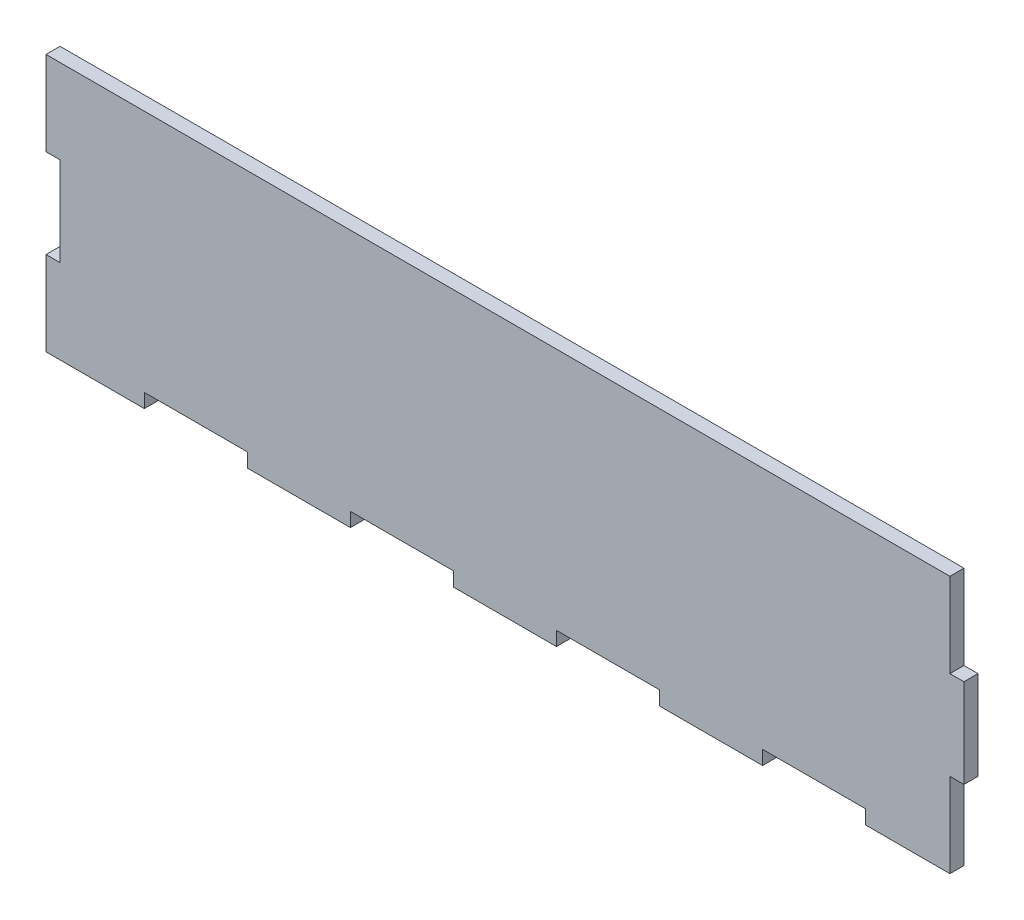
ISO-10303-21;
HEADER;
FILE_DESCRIPTION(('STEP AP214'),'2;1');
FILE_NAME('part.step','',(''),(''),'','','');
FILE_SCHEMA(('AUTOMOTIVE_DESIGN { 1 0 10303 214 1 1 1 1 }'));
ENDSEC;
DATA;
#1=APPLICATION_CONTEXT('core data for automotive mechanical design processes');
#2=APPLICATION_PROTOCOL_DEFINITION('international standard','automotive_design',2000,#1);
#3=PRODUCT_CONTEXT('',#1,'mechanical');
#4=PRODUCT('Part','Part','',(#3));
#5=PRODUCT_RELATED_PRODUCT_CATEGORY('part','',(#4));
#6=PRODUCT_DEFINITION_FORMATION('','',#4);
#7=PRODUCT_DEFINITION_CONTEXT('part definition',#1,'design');
#8=PRODUCT_DEFINITION('design','',#6,#7);
#9=PRODUCT_DEFINITION_SHAPE('','',#8);
#10=(LENGTH_UNIT() NAMED_UNIT(*) SI_UNIT(.MILLI.,.METRE.));
#11=(NAMED_UNIT(*) PLANE_ANGLE_UNIT() SI_UNIT($,.RADIAN.));
#12=(NAMED_UNIT(*) SI_UNIT($,.STERADIAN.) SOLID_ANGLE_UNIT());
#13=UNCERTAINTY_MEASURE_WITH_UNIT(LENGTH_MEASURE(1.E-05),#10,'distance_accuracy_value','');
#14=(GEOMETRIC_REPRESENTATION_CONTEXT(3) GLOBAL_UNCERTAINTY_ASSIGNED_CONTEXT((#13)) GLOBAL_UNIT_ASSIGNED_CONTEXT((#10,
#11,#12)) REPRESENTATION_CONTEXT('',''));
#15=CARTESIAN_POINT('',(0.,0.,0.));
#16=DIRECTION('',(0.,0.,1.));
#17=DIRECTION('',(1.,0.,0.));
#18=AXIS2_PLACEMENT_3D('',#15,#16,#17);
#19=CARTESIAN_POINT('',(0.,-24.5,3.));
#20=DIRECTION('',(0.,1.,0.));
#21=DIRECTION('',(0.,0.,1.));
#22=AXIS2_PLACEMENT_3D('',#19,#20,#21);
#23=PLANE('',#22);
#24=DIRECTION('',(1.,0.,0.));
#25=VECTOR('',#24,1.);
#26=CARTESIAN_POINT('',(0.,-24.5,0.));
#27=LINE('',#26,#25);
#28=CARTESIAN_POINT('',(55.,-24.5,0.));
#29=VERTEX_POINT('',#28);
#30=CARTESIAN_POINT('',(77.,-24.5,0.));
#31=VERTEX_POINT('',#30);
#32=EDGE_CURVE('E290',#29,#31,#27,.T.);
#33=ORIENTED_EDGE('',*,*,#32,.T.);
#34=DIRECTION('',(0.,0.,-1.));
#35=VECTOR('',#34,1.);
#36=CARTESIAN_POINT('',(77.,-24.5,3.));
#37=LINE('',#36,#35);
#38=CARTESIAN_POINT('',(77.,-24.5,3.));
#39=VERTEX_POINT('',#38);
#40=EDGE_CURVE('E11',#39,#31,#37,.T.);
#41=ORIENTED_EDGE('',*,*,#40,.F.);
#42=DIRECTION('',(1.,0.,0.));
#43=VECTOR('',#42,1.);
#44=CARTESIAN_POINT('',(0.,-24.5,3.));
#45=LINE('',#44,#43);
#46=CARTESIAN_POINT('',(55.,-24.5,3.));
#47=VERTEX_POINT('',#46);
#48=EDGE_CURVE('E263',#47,#39,#45,.T.);
#49=ORIENTED_EDGE('',*,*,#48,.F.);
#50=DIRECTION('',(0.,0.,-1.));
#51=VECTOR('',#50,1.);
#52=CARTESIAN_POINT('',(55.,-24.5,3.));
#53=LINE('',#52,#51);
#54=EDGE_CURVE('E249',#47,#29,#53,.T.);
#55=ORIENTED_EDGE('',*,*,#54,.T.);
#56=EDGE_LOOP('',(#33,#41,#49,#55));
#57=FACE_BOUND('',#56,.T.);
#58=ADVANCED_FACE('F35',(#57),#23,.F.);
#59=CARTESIAN_POINT('',(77.0000000000001,-3.56196553733905E-13,3.));
#60=DIRECTION('',(1.,0.,0.));
#61=DIRECTION('',(0.,1.,0.));
#62=AXIS2_PLACEMENT_3D('',#59,#60,#61);
#63=PLANE('',#62);
#64=DIRECTION('',(0.,-1.,0.));
#65=VECTOR('',#64,1.);
#66=CARTESIAN_POINT('',(77.0000000000001,-3.56196553733905E-13,0.));
#67=LINE('',#66,#65);
#68=CARTESIAN_POINT('',(77.,-27.5,0.));
#69=VERTEX_POINT('',#68);
#70=EDGE_CURVE('E293',#31,#69,#67,.T.);
#71=ORIENTED_EDGE('',*,*,#70,.T.);
#72=DIRECTION('',(0.,0.,-1.));
#73=VECTOR('',#72,1.);
#74=CARTESIAN_POINT('',(77.,-27.5,3.));
#75=LINE('',#74,#73);
#76=CARTESIAN_POINT('',(77.,-27.5,3.));
#77=VERTEX_POINT('',#76);
#78=EDGE_CURVE('E43',#77,#69,#75,.T.);
#79=ORIENTED_EDGE('',*,*,#78,.F.);
#80=DIRECTION('',(0.,-1.,0.));
#81=VECTOR('',#80,1.);
#82=CARTESIAN_POINT('',(77.0000000000001,-3.56196553733905E-13,3.));
#83=LINE('',#82,#81);
#84=EDGE_CURVE('E154',#39,#77,#83,.T.);
#85=ORIENTED_EDGE('',*,*,#84,.F.);
#86=ORIENTED_EDGE('',*,*,#40,.T.);
#87=EDGE_LOOP('',(#71,#79,#85,#86));
#88=FACE_BOUND('',#87,.T.);
#89=ADVANCED_FACE('F535',(#88),#63,.F.);
#90=CARTESIAN_POINT('',(0.,-27.5,3.));
#91=DIRECTION('',(0.,1.,0.));
#92=DIRECTION('',(0.,0.,1.));
#93=AXIS2_PLACEMENT_3D('',#90,#91,#92);
#94=PLANE('',#93);
#95=DIRECTION('',(1.,0.,0.));
#96=VECTOR('',#95,1.);
#97=CARTESIAN_POINT('',(0.,-27.5,0.));
#98=LINE('',#97,#96);
#99=CARTESIAN_POINT('',(95.,-27.5,0.));
#100=VERTEX_POINT('',#99);
#101=EDGE_CURVE('E295',#69,#100,#98,.T.);
#102=ORIENTED_EDGE('',*,*,#101,.T.);
#103=DIRECTION('',(0.,0.,-1.));
#104=VECTOR('',#103,1.);
#105=CARTESIAN_POINT('',(95.,-27.5,3.));
#106=LINE('',#105,#104);
#107=CARTESIAN_POINT('',(95.,-27.5,3.));
#108=VERTEX_POINT('',#107);
#109=EDGE_CURVE('E405',#108,#100,#106,.T.);
#110=ORIENTED_EDGE('',*,*,#109,.F.);
#111=DIRECTION('',(1.,0.,0.));
#112=VECTOR('',#111,1.);
#113=CARTESIAN_POINT('',(0.,-27.5,3.));
#114=LINE('',#113,#112);
#115=EDGE_CURVE('E248',#77,#108,#114,.T.);
#116=ORIENTED_EDGE('',*,*,#115,.F.);
#117=ORIENTED_EDGE('',*,*,#78,.T.);
#118=EDGE_LOOP('',(#102,#110,#116,#117));
#119=FACE_BOUND('',#118,.T.);
#120=ADVANCED_FACE('F409',(#119),#94,.F.);
#121=CARTESIAN_POINT('',(95.,0.,3.));
#122=DIRECTION('',(1.,0.,0.));
#123=DIRECTION('',(0.,0.,-1.));
#124=AXIS2_PLACEMENT_3D('',#121,#122,#123);
#125=PLANE('',#124);
#126=DIRECTION('',(0.,-1.,0.));
#127=VECTOR('',#126,1.);
#128=CARTESIAN_POINT('',(95.,0.,0.));
#129=LINE('',#128,#127);
#130=CARTESIAN_POINT('',(95.,-9.5,0.));
#131=VERTEX_POINT('',#130);
#132=EDGE_CURVE('E298',#131,#100,#129,.T.);
#133=ORIENTED_EDGE('',*,*,#132,.F.);
#134=DIRECTION('',(0.,0.,-1.));
#135=VECTOR('',#134,1.);
#136=CARTESIAN_POINT('',(95.,-9.5,3.));
#137=LINE('',#136,#135);
#138=CARTESIAN_POINT('',(95.,-9.5,3.));
#139=VERTEX_POINT('',#138);
#140=EDGE_CURVE('E403',#139,#131,#137,.T.);
#141=ORIENTED_EDGE('',*,*,#140,.F.);
#142=DIRECTION('',(0.,-1.,0.));
#143=VECTOR('',#142,1.);
#144=CARTESIAN_POINT('',(95.,0.,3.));
#145=LINE('',#144,#143);
#146=EDGE_CURVE('E256',#139,#108,#145,.T.);
#147=ORIENTED_EDGE('',*,*,#146,.T.);
#148=ORIENTED_EDGE('',*,*,#109,.T.);
#149=EDGE_LOOP('',(#133,#141,#147,#148));
#150=FACE_BOUND('',#149,.T.);
#151=ADVANCED_FACE('F417',(#150),#125,.T.);
#152=CARTESIAN_POINT('',(0.,-9.50000000000006,3.));
#153=DIRECTION('',(0.,-1.,0.));
#154=DIRECTION('',(1.,0.,0.));
#155=AXIS2_PLACEMENT_3D('',#152,#153,#154);
#156=PLANE('',#155);
#157=DIRECTION('',(-1.,0.,0.));
#158=VECTOR('',#157,1.);
#159=CARTESIAN_POINT('',(0.,-9.50000000000006,0.));
#160=LINE('',#159,#158);
#161=CARTESIAN_POINT('',(98.,-9.5,0.));
#162=VERTEX_POINT('',#161);
#163=EDGE_CURVE('E302',#162,#131,#160,.T.);
#164=ORIENTED_EDGE('',*,*,#163,.F.);
#165=DIRECTION('',(0.,0.,-1.));
#166=VECTOR('',#165,1.);
#167=CARTESIAN_POINT('',(98.,-9.5,3.));
#168=LINE('',#167,#166);
#169=CARTESIAN_POINT('',(98.,-9.5,3.));
#170=VERTEX_POINT('',#169);
#171=EDGE_CURVE('E401',#170,#162,#168,.T.);
#172=ORIENTED_EDGE('',*,*,#171,.F.);
#173=DIRECTION('',(-1.,0.,0.));
#174=VECTOR('',#173,1.);
#175=CARTESIAN_POINT('',(0.,-9.50000000000006,3.));
#176=LINE('',#175,#174);
#177=EDGE_CURVE('E262',#170,#139,#176,.T.);
#178=ORIENTED_EDGE('',*,*,#177,.T.);
#179=ORIENTED_EDGE('',*,*,#140,.T.);
#180=EDGE_LOOP('',(#164,#172,#178,#179));
#181=FACE_BOUND('',#180,.T.);
#182=ADVANCED_FACE('F421',(#181),#156,.T.);
#183=CARTESIAN_POINT('',(98.,0.,3.));
#184=DIRECTION('',(-1.,0.,0.));
#185=DIRECTION('',(0.,0.,1.));
#186=AXIS2_PLACEMENT_3D('',#183,#184,#185);
#187=PLANE('',#186);
#188=DIRECTION('',(0.,1.,0.));
#189=VECTOR('',#188,1.);
#190=CARTESIAN_POINT('',(98.,0.,0.));
#191=LINE('',#190,#189);
#192=CARTESIAN_POINT('',(98.,9.50000000000002,0.));
#193=VERTEX_POINT('',#192);
#194=EDGE_CURVE('E305',#162,#193,#191,.T.);
#195=ORIENTED_EDGE('',*,*,#194,.T.);
#196=DIRECTION('',(0.,0.,-1.));
#197=VECTOR('',#196,1.);
#198=CARTESIAN_POINT('',(98.,9.50000000000002,3.));
#199=LINE('',#198,#197);
#200=CARTESIAN_POINT('',(98.,9.50000000000002,3.));
#201=VERTEX_POINT('',#200);
#202=EDGE_CURVE('E398',#201,#193,#199,.T.);
#203=ORIENTED_EDGE('',*,*,#202,.F.);
#204=DIRECTION('',(0.,1.,0.));
#205=VECTOR('',#204,1.);
#206=CARTESIAN_POINT('',(98.,0.,3.));
#207=LINE('',#206,#205);
#208=EDGE_CURVE('E423',#170,#201,#207,.T.);
#209=ORIENTED_EDGE('',*,*,#208,.F.);
#210=ORIENTED_EDGE('',*,*,#171,.T.);
#211=EDGE_LOOP('',(#195,#203,#209,#210));
#212=FACE_BOUND('',#211,.T.);
#213=ADVANCED_FACE('F525',(#212),#187,.F.);
#214=CARTESIAN_POINT('',(0.,9.50000000000074,3.));
#215=DIRECTION('',(0.,-1.,0.));
#216=DIRECTION('',(1.,0.,0.));
#217=AXIS2_PLACEMENT_3D('',#214,#215,#216);
#218=PLANE('',#217);
#219=DIRECTION('',(-1.,0.,0.));
#220=VECTOR('',#219,1.);
#221=CARTESIAN_POINT('',(0.,9.50000000000074,0.));
#222=LINE('',#221,#220);
#223=CARTESIAN_POINT('',(95.,9.50000000000003,0.));
#224=VERTEX_POINT('',#223);
#225=EDGE_CURVE('E307',#193,#224,#222,.T.);
#226=ORIENTED_EDGE('',*,*,#225,.T.);
#227=DIRECTION('',(0.,0.,-1.));
#228=VECTOR('',#227,1.);
#229=CARTESIAN_POINT('',(95.,9.50000000000003,3.));
#230=LINE('',#229,#228);
#231=CARTESIAN_POINT('',(95.,9.50000000000003,3.));
#232=VERTEX_POINT('',#231);
#233=EDGE_CURVE('E395',#232,#224,#230,.T.);
#234=ORIENTED_EDGE('',*,*,#233,.F.);
#235=DIRECTION('',(-1.,0.,0.));
#236=VECTOR('',#235,1.);
#237=CARTESIAN_POINT('',(0.,9.50000000000074,3.));
#238=LINE('',#237,#236);
#239=EDGE_CURVE('E425',#201,#232,#238,.T.);
#240=ORIENTED_EDGE('',*,*,#239,.F.);
#241=ORIENTED_EDGE('',*,*,#202,.T.);
#242=EDGE_LOOP('',(#226,#234,#240,#241));
#243=FACE_BOUND('',#242,.T.);
#244=ADVANCED_FACE('F522',(#243),#218,.F.);
#245=CARTESIAN_POINT('',(95.,0.,3.));
#246=DIRECTION('',(-1.,0.,0.));
#247=DIRECTION('',(0.,0.,1.));
#248=AXIS2_PLACEMENT_3D('',#245,#246,#247);
#249=PLANE('',#248);
#250=DIRECTION('',(0.,1.,0.));
#251=VECTOR('',#250,1.);
#252=CARTESIAN_POINT('',(95.,0.,0.));
#253=LINE('',#252,#251);
#254=CARTESIAN_POINT('',(95.,27.5,0.));
#255=VERTEX_POINT('',#254);
#256=EDGE_CURVE('E309',#224,#255,#253,.T.);
#257=ORIENTED_EDGE('',*,*,#256,.T.);
#258=DIRECTION('',(0.,0.,-1.));
#259=VECTOR('',#258,1.);
#260=CARTESIAN_POINT('',(95.,27.5,3.));
#261=LINE('',#260,#259);
#262=CARTESIAN_POINT('',(95.,27.5,3.));
#263=VERTEX_POINT('',#262);
#264=EDGE_CURVE('E393',#263,#255,#261,.T.);
#265=ORIENTED_EDGE('',*,*,#264,.F.);
#266=DIRECTION('',(0.,1.,0.));
#267=VECTOR('',#266,1.);
#268=CARTESIAN_POINT('',(95.,0.,3.));
#269=LINE('',#268,#267);
#270=EDGE_CURVE('E429',#232,#263,#269,.T.);
#271=ORIENTED_EDGE('',*,*,#270,.F.);
#272=ORIENTED_EDGE('',*,*,#233,.T.);
#273=EDGE_LOOP('',(#257,#265,#271,#272));
#274=FACE_BOUND('',#273,.T.);
#275=ADVANCED_FACE('F518',(#274),#249,.F.);
#276=CARTESIAN_POINT('',(0.,27.5,3.));
#277=DIRECTION('',(0.,1.,0.));
#278=DIRECTION('',(0.,0.,1.));
#279=AXIS2_PLACEMENT_3D('',#276,#277,#278);
#280=PLANE('',#279);
#281=DIRECTION('',(1.,0.,0.));
#282=VECTOR('',#281,1.);
#283=CARTESIAN_POINT('',(0.,27.5,0.));
#284=LINE('',#283,#282);
#285=CARTESIAN_POINT('',(-98.,27.5,0.));
#286=VERTEX_POINT('',#285);
#287=EDGE_CURVE('E312',#286,#255,#284,.T.);
#288=ORIENTED_EDGE('',*,*,#287,.F.);
#289=DIRECTION('',(0.,0.,-1.));
#290=VECTOR('',#289,1.);
#291=CARTESIAN_POINT('',(-98.,27.5,3.));
#292=LINE('',#291,#290);
#293=CARTESIAN_POINT('',(-98.,27.5,3.));
#294=VERTEX_POINT('',#293);
#295=EDGE_CURVE('E391',#294,#286,#292,.T.);
#296=ORIENTED_EDGE('',*,*,#295,.F.);
#297=DIRECTION('',(1.,0.,0.));
#298=VECTOR('',#297,1.);
#299=CARTESIAN_POINT('',(0.,27.5,3.));
#300=LINE('',#299,#298);
#301=EDGE_CURVE('E431',#294,#263,#300,.T.);
#302=ORIENTED_EDGE('',*,*,#301,.T.);
#303=ORIENTED_EDGE('',*,*,#264,.T.);
#304=EDGE_LOOP('',(#288,#296,#302,#303));
#305=FACE_BOUND('',#304,.T.);
#306=ADVANCED_FACE('F513',(#305),#280,.T.);
#307=CARTESIAN_POINT('',(-98.,0.,3.));
#308=DIRECTION('',(-1.,0.,0.));
#309=DIRECTION('',(0.,0.,1.));
#310=AXIS2_PLACEMENT_3D('',#307,#308,#309);
#311=PLANE('',#310);
#312=DIRECTION('',(0.,1.,0.));
#313=VECTOR('',#312,1.);
#314=CARTESIAN_POINT('',(-98.,0.,0.));
#315=LINE('',#314,#313);
#316=CARTESIAN_POINT('',(-98.,9.5,0.));
#317=VERTEX_POINT('',#316);
#318=EDGE_CURVE('E315',#317,#286,#315,.T.);
#319=ORIENTED_EDGE('',*,*,#318,.F.);
#320=DIRECTION('',(0.,0.,-1.));
#321=VECTOR('',#320,1.);
#322=CARTESIAN_POINT('',(-98.,9.5,3.));
#323=LINE('',#322,#321);
#324=CARTESIAN_POINT('',(-98.,9.5,3.));
#325=VERTEX_POINT('',#324);
#326=EDGE_CURVE('E389',#325,#317,#323,.T.);
#327=ORIENTED_EDGE('',*,*,#326,.F.);
#328=DIRECTION('',(0.,1.,0.));
#329=VECTOR('',#328,1.);
#330=CARTESIAN_POINT('',(-98.,0.,3.));
#331=LINE('',#330,#329);
#332=EDGE_CURVE('E274',#325,#294,#331,.T.);
#333=ORIENTED_EDGE('',*,*,#332,.T.);
#334=ORIENTED_EDGE('',*,*,#295,.T.);
#335=EDGE_LOOP('',(#319,#327,#333,#334));
#336=FACE_BOUND('',#335,.T.);
#337=ADVANCED_FACE('F508',(#336),#311,.T.);
#338=CARTESIAN_POINT('',(0.,9.49999999999989,3.));
#339=DIRECTION('',(0.,-1.,0.));
#340=DIRECTION('',(1.,0.,0.));
#341=AXIS2_PLACEMENT_3D('',#338,#339,#340);
#342=PLANE('',#341);
#343=DIRECTION('',(-1.,0.,0.));
#344=VECTOR('',#343,1.);
#345=CARTESIAN_POINT('',(0.,9.49999999999989,0.));
#346=LINE('',#345,#344);
#347=CARTESIAN_POINT('',(-95.,9.5,0.));
#348=VERTEX_POINT('',#347);
#349=EDGE_CURVE('E318',#348,#317,#346,.T.);
#350=ORIENTED_EDGE('',*,*,#349,.F.);
#351=DIRECTION('',(0.,0.,-1.));
#352=VECTOR('',#351,1.);
#353=CARTESIAN_POINT('',(-95.,9.5,3.));
#354=LINE('',#353,#352);
#355=CARTESIAN_POINT('',(-95.,9.5,3.));
#356=VERTEX_POINT('',#355);
#357=EDGE_CURVE('E387',#356,#348,#354,.T.);
#358=ORIENTED_EDGE('',*,*,#357,.F.);
#359=DIRECTION('',(-1.,0.,0.));
#360=VECTOR('',#359,1.);
#361=CARTESIAN_POINT('',(0.,9.49999999999989,3.));
#362=LINE('',#361,#360);
#363=EDGE_CURVE('E435',#356,#325,#362,.T.);
#364=ORIENTED_EDGE('',*,*,#363,.T.);
#365=ORIENTED_EDGE('',*,*,#326,.T.);
#366=EDGE_LOOP('',(#350,#358,#364,#365));
#367=FACE_BOUND('',#366,.T.);
#368=ADVANCED_FACE('F504',(#367),#342,.T.);
#369=CARTESIAN_POINT('',(-95.,0.,3.));
#370=DIRECTION('',(-1.,0.,0.));
#371=DIRECTION('',(0.,0.,1.));
#372=AXIS2_PLACEMENT_3D('',#369,#370,#371);
#373=PLANE('',#372);
#374=DIRECTION('',(0.,1.,0.));
#375=VECTOR('',#374,1.);
#376=CARTESIAN_POINT('',(-95.,0.,0.));
#377=LINE('',#376,#375);
#378=CARTESIAN_POINT('',(-95.,-9.50000000000002,0.));
#379=VERTEX_POINT('',#378);
#380=EDGE_CURVE('E322',#379,#348,#377,.T.);
#381=ORIENTED_EDGE('',*,*,#380,.F.);
#382=DIRECTION('',(0.,0.,-1.));
#383=VECTOR('',#382,1.);
#384=CARTESIAN_POINT('',(-95.,-9.50000000000002,3.));
#385=LINE('',#384,#383);
#386=CARTESIAN_POINT('',(-95.,-9.50000000000002,3.));
#387=VERTEX_POINT('',#386);
#388=EDGE_CURVE('E385',#387,#379,#385,.T.);
#389=ORIENTED_EDGE('',*,*,#388,.F.);
#390=DIRECTION('',(0.,1.,0.));
#391=VECTOR('',#390,1.);
#392=CARTESIAN_POINT('',(-95.,0.,3.));
#393=LINE('',#392,#391);
#394=EDGE_CURVE('E438',#387,#356,#393,.T.);
#395=ORIENTED_EDGE('',*,*,#394,.T.);
#396=ORIENTED_EDGE('',*,*,#357,.T.);
#397=EDGE_LOOP('',(#381,#389,#395,#396));
#398=FACE_BOUND('',#397,.T.);
#399=ADVANCED_FACE('F502',(#398),#373,.T.);
#400=CARTESIAN_POINT('',(0.,-9.50000000000079,3.));
#401=DIRECTION('',(0.,1.,0.));
#402=DIRECTION('',(-1.,0.,0.));
#403=AXIS2_PLACEMENT_3D('',#400,#401,#402);
#404=PLANE('',#403);
#405=DIRECTION('',(1.,0.,0.));
#406=VECTOR('',#405,1.);
#407=CARTESIAN_POINT('',(0.,-9.50000000000079,0.));
#408=LINE('',#407,#406);
#409=CARTESIAN_POINT('',(-98.,-9.5,0.));
#410=VERTEX_POINT('',#409);
#411=EDGE_CURVE('E325',#410,#379,#408,.T.);
#412=ORIENTED_EDGE('',*,*,#411,.F.);
#413=DIRECTION('',(0.,0.,-1.));
#414=VECTOR('',#413,1.);
#415=CARTESIAN_POINT('',(-98.,-9.5,3.));
#416=LINE('',#415,#414);
#417=CARTESIAN_POINT('',(-98.,-9.5,3.));
#418=VERTEX_POINT('',#417);
#419=EDGE_CURVE('E383',#418,#410,#416,.T.);
#420=ORIENTED_EDGE('',*,*,#419,.F.);
#421=DIRECTION('',(1.,0.,0.));
#422=VECTOR('',#421,1.);
#423=CARTESIAN_POINT('',(0.,-9.50000000000079,3.));
#424=LINE('',#423,#422);
#425=EDGE_CURVE('E272',#418,#387,#424,.T.);
#426=ORIENTED_EDGE('',*,*,#425,.T.);
#427=ORIENTED_EDGE('',*,*,#388,.T.);
#428=EDGE_LOOP('',(#412,#420,#426,#427));
#429=FACE_BOUND('',#428,.T.);
#430=ADVANCED_FACE('F445',(#429),#404,.T.);
#431=CARTESIAN_POINT('',(-98.,-27.5,0.));
#432=VERTEX_POINT('',#431);
#433=EDGE_CURVE('E319',#432,#410,#315,.T.);
#434=ORIENTED_EDGE('',*,*,#433,.F.);
#435=DIRECTION('',(0.,0.,-1.));
#436=VECTOR('',#435,1.);
#437=CARTESIAN_POINT('',(-98.,-27.5,3.));
#438=LINE('',#437,#436);
#439=CARTESIAN_POINT('',(-98.,-27.5,3.));
#440=VERTEX_POINT('',#439);
#441=EDGE_CURVE('E381',#440,#432,#438,.T.);
#442=ORIENTED_EDGE('',*,*,#441,.F.);
#443=EDGE_CURVE('E265',#440,#418,#331,.T.);
#444=ORIENTED_EDGE('',*,*,#443,.T.);
#445=ORIENTED_EDGE('',*,*,#419,.T.);
#446=EDGE_LOOP('',(#434,#442,#444,#445));
#447=FACE_BOUND('',#446,.T.);
#448=ADVANCED_FACE('F451',(#447),#311,.T.);
#449=CARTESIAN_POINT('',(-77.,-27.5,0.));
#450=VERTEX_POINT('',#449);
#451=EDGE_CURVE('E299',#432,#450,#98,.T.);
#452=ORIENTED_EDGE('',*,*,#451,.T.);
#453=DIRECTION('',(0.,0.,-1.));
#454=VECTOR('',#453,1.);
#455=CARTESIAN_POINT('',(-77.,-27.5,3.));
#456=LINE('',#455,#454);
#457=CARTESIAN_POINT('',(-77.,-27.5,3.));
#458=VERTEX_POINT('',#457);
#459=EDGE_CURVE('E378',#458,#450,#456,.T.);
#460=ORIENTED_EDGE('',*,*,#459,.F.);
#461=EDGE_CURVE('E257',#440,#458,#114,.T.);
#462=ORIENTED_EDGE('',*,*,#461,.F.);
#463=ORIENTED_EDGE('',*,*,#441,.T.);
#464=EDGE_LOOP('',(#452,#460,#462,#463));
#465=FACE_BOUND('',#464,.T.);
#466=ADVANCED_FACE('F455',(#465),#94,.F.);
#467=CARTESIAN_POINT('',(-77.,0.,3.));
#468=DIRECTION('',(-1.,0.,0.));
#469=DIRECTION('',(0.,0.,1.));
#470=AXIS2_PLACEMENT_3D('',#467,#468,#469);
#471=PLANE('',#470);
#472=DIRECTION('',(0.,1.,0.));
#473=VECTOR('',#472,1.);
#474=CARTESIAN_POINT('',(-77.,0.,0.));
#475=LINE('',#474,#473);
#476=CARTESIAN_POINT('',(-77.,-24.5,0.));
#477=VERTEX_POINT('',#476);
#478=EDGE_CURVE('E328',#450,#477,#475,.T.);
#479=ORIENTED_EDGE('',*,*,#478,.T.);
#480=DIRECTION('',(0.,0.,-1.));
#481=VECTOR('',#480,1.);
#482=CARTESIAN_POINT('',(-77.,-24.5,3.));
#483=LINE('',#482,#481);
#484=CARTESIAN_POINT('',(-77.,-24.5,3.));
#485=VERTEX_POINT('',#484);
#486=EDGE_CURVE('E375',#485,#477,#483,.T.);
#487=ORIENTED_EDGE('',*,*,#486,.F.);
#488=DIRECTION('',(0.,1.,0.));
#489=VECTOR('',#488,1.);
#490=CARTESIAN_POINT('',(-77.,0.,3.));
#491=LINE('',#490,#489);
#492=EDGE_CURVE('E264',#458,#485,#491,.T.);
#493=ORIENTED_EDGE('',*,*,#492,.F.);
#494=ORIENTED_EDGE('',*,*,#459,.T.);
#495=EDGE_LOOP('',(#479,#487,#493,#494));
#496=FACE_BOUND('',#495,.T.);
#497=ADVANCED_FACE('F460',(#496),#471,.F.);
#498=CARTESIAN_POINT('',(0.,-24.5,3.));
#499=DIRECTION('',(0.,1.,0.));
#500=DIRECTION('',(0.,0.,1.));
#501=AXIS2_PLACEMENT_3D('',#498,#499,#500);
#502=PLANE('',#501);
#503=DIRECTION('',(1.,0.,0.));
#504=VECTOR('',#503,1.);
#505=CARTESIAN_POINT('',(0.,-24.5,0.));
#506=LINE('',#505,#504);
#507=CARTESIAN_POINT('',(-55.,-24.5,0.));
#508=VERTEX_POINT('',#507);
#509=EDGE_CURVE('E330',#477,#508,#506,.T.);
#510=ORIENTED_EDGE('',*,*,#509,.T.);
#511=DIRECTION('',(0.,0.,-1.));
#512=VECTOR('',#511,1.);
#513=CARTESIAN_POINT('',(-55.,-24.5,3.));
#514=LINE('',#513,#512);
#515=CARTESIAN_POINT('',(-55.,-24.5,3.));
#516=VERTEX_POINT('',#515);
#517=EDGE_CURVE('E372',#516,#508,#514,.T.);
#518=ORIENTED_EDGE('',*,*,#517,.F.);
#519=DIRECTION('',(1.,0.,0.));
#520=VECTOR('',#519,1.);
#521=CARTESIAN_POINT('',(0.,-24.5,3.));
#522=LINE('',#521,#520);
#523=EDGE_CURVE('E269',#485,#516,#522,.T.);
#524=ORIENTED_EDGE('',*,*,#523,.F.);
#525=ORIENTED_EDGE('',*,*,#486,.T.);
#526=EDGE_LOOP('',(#510,#518,#524,#525));
#527=FACE_BOUND('',#526,.T.);
#528=ADVANCED_FACE('F464',(#527),#502,.F.);
#529=CARTESIAN_POINT('',(-54.9999999999999,1.27213054904966E-13,3.));
#530=DIRECTION('',(1.,0.,0.));
#531=DIRECTION('',(0.,1.,0.));
#532=AXIS2_PLACEMENT_3D('',#529,#530,#531);
#533=PLANE('',#532);
#534=DIRECTION('',(0.,-1.,0.));
#535=VECTOR('',#534,1.);
#536=CARTESIAN_POINT('',(-54.9999999999999,1.27213054904966E-13,0.));
#537=LINE('',#536,#535);
#538=CARTESIAN_POINT('',(-55.,-27.5,0.));
#539=VERTEX_POINT('',#538);
#540=EDGE_CURVE('E332',#508,#539,#537,.T.);
#541=ORIENTED_EDGE('',*,*,#540,.T.);
#542=DIRECTION('',(0.,0.,-1.));
#543=VECTOR('',#542,1.);
#544=CARTESIAN_POINT('',(-55.,-27.5,3.));
#545=LINE('',#544,#543);
#546=CARTESIAN_POINT('',(-55.,-27.5,3.));
#547=VERTEX_POINT('',#546);
#548=EDGE_CURVE('E369',#547,#539,#545,.T.);
#549=ORIENTED_EDGE('',*,*,#548,.F.);
#550=DIRECTION('',(0.,-1.,0.));
#551=VECTOR('',#550,1.);
#552=CARTESIAN_POINT('',(-54.9999999999999,1.27213054904966E-13,3.));
#553=LINE('',#552,#551);
#554=EDGE_CURVE('E276',#516,#547,#553,.T.);
#555=ORIENTED_EDGE('',*,*,#554,.F.);
#556=ORIENTED_EDGE('',*,*,#517,.T.);
#557=EDGE_LOOP('',(#541,#549,#555,#556));
#558=FACE_BOUND('',#557,.T.);
#559=ADVANCED_FACE('F468',(#558),#533,.F.);
#560=CARTESIAN_POINT('',(-33.,-27.5,0.));
#561=VERTEX_POINT('',#560);
#562=EDGE_CURVE('E334',#539,#561,#98,.T.);
#563=ORIENTED_EDGE('',*,*,#562,.T.);
#564=DIRECTION('',(0.,0.,-1.));
#565=VECTOR('',#564,1.);
#566=CARTESIAN_POINT('',(-33.,-27.5,3.));
#567=LINE('',#566,#565);
#568=CARTESIAN_POINT('',(-33.,-27.5,3.));
#569=VERTEX_POINT('',#568);
#570=EDGE_CURVE('E366',#569,#561,#567,.T.);
#571=ORIENTED_EDGE('',*,*,#570,.F.);
#572=EDGE_CURVE('E255',#547,#569,#114,.T.);
#573=ORIENTED_EDGE('',*,*,#572,.F.);
#574=ORIENTED_EDGE('',*,*,#548,.T.);
#575=EDGE_LOOP('',(#563,#571,#573,#574));
#576=FACE_BOUND('',#575,.T.);
#577=ADVANCED_FACE('F471',(#576),#94,.F.);
#578=CARTESIAN_POINT('',(-33.,0.,3.));
#579=DIRECTION('',(-1.,0.,0.));
#580=DIRECTION('',(0.,0.,1.));
#581=AXIS2_PLACEMENT_3D('',#578,#579,#580);
#582=PLANE('',#581);
#583=DIRECTION('',(0.,1.,0.));
#584=VECTOR('',#583,1.);
#585=CARTESIAN_POINT('',(-33.,0.,0.));
#586=LINE('',#585,#584);
#587=CARTESIAN_POINT('',(-33.,-24.5,0.));
#588=VERTEX_POINT('',#587);
#589=EDGE_CURVE('E335',#561,#588,#586,.T.);
#590=ORIENTED_EDGE('',*,*,#589,.T.);
#591=DIRECTION('',(0.,0.,-1.));
#592=VECTOR('',#591,1.);
#593=CARTESIAN_POINT('',(-33.,-24.5,3.));
#594=LINE('',#593,#592);
#595=CARTESIAN_POINT('',(-33.,-24.5,3.));
#596=VERTEX_POINT('',#595);
#597=EDGE_CURVE('E363',#596,#588,#594,.T.);
#598=ORIENTED_EDGE('',*,*,#597,.F.);
#599=DIRECTION('',(0.,1.,0.));
#600=VECTOR('',#599,1.);
#601=CARTESIAN_POINT('',(-33.,0.,3.));
#602=LINE('',#601,#600);
#603=EDGE_CURVE('E275',#569,#596,#602,.T.);
#604=ORIENTED_EDGE('',*,*,#603,.F.);
#605=ORIENTED_EDGE('',*,*,#570,.T.);
#606=EDGE_LOOP('',(#590,#598,#604,#605));
#607=FACE_BOUND('',#606,.T.);
#608=ADVANCED_FACE('F476',(#607),#582,.F.);
#609=CARTESIAN_POINT('',(0.,-24.5,3.));
#610=DIRECTION('',(0.,1.,0.));
#611=DIRECTION('',(0.,0.,1.));
#612=AXIS2_PLACEMENT_3D('',#609,#610,#611);
#613=PLANE('',#612);
#614=DIRECTION('',(1.,0.,0.));
#615=VECTOR('',#614,1.);
#616=CARTESIAN_POINT('',(0.,-24.5,0.));
#617=LINE('',#616,#615);
#618=CARTESIAN_POINT('',(-11.,-24.5,0.));
#619=VERTEX_POINT('',#618);
#620=EDGE_CURVE('E337',#588,#619,#617,.T.);
#621=ORIENTED_EDGE('',*,*,#620,.T.);
#622=DIRECTION('',(0.,0.,-1.));
#623=VECTOR('',#622,1.);
#624=CARTESIAN_POINT('',(-11.,-24.5,3.));
#625=LINE('',#624,#623);
#626=CARTESIAN_POINT('',(-11.,-24.5,3.));
#627=VERTEX_POINT('',#626);
#628=EDGE_CURVE('E360',#627,#619,#625,.T.);
#629=ORIENTED_EDGE('',*,*,#628,.F.);
#630=DIRECTION('',(1.,0.,0.));
#631=VECTOR('',#630,1.);
#632=CARTESIAN_POINT('',(0.,-24.5,3.));
#633=LINE('',#632,#631);
#634=EDGE_CURVE('E279',#596,#627,#633,.T.);
#635=ORIENTED_EDGE('',*,*,#634,.F.);
#636=ORIENTED_EDGE('',*,*,#597,.T.);
#637=EDGE_LOOP('',(#621,#629,#635,#636));
#638=FACE_BOUND('',#637,.T.);
#639=ADVANCED_FACE('F482',(#638),#613,.F.);
#640=CARTESIAN_POINT('',(-11.,0.,3.));
#641=DIRECTION('',(1.,0.,0.));
#642=DIRECTION('',(0.,0.,-1.));
#643=AXIS2_PLACEMENT_3D('',#640,#641,#642);
#644=PLANE('',#643);
#645=DIRECTION('',(0.,-1.,0.));
#646=VECTOR('',#645,1.);
#647=CARTESIAN_POINT('',(-11.,0.,0.));
#648=LINE('',#647,#646);
#649=CARTESIAN_POINT('',(-11.,-27.5,0.));
#650=VERTEX_POINT('',#649);
#651=EDGE_CURVE('E339',#619,#650,#648,.T.);
#652=ORIENTED_EDGE('',*,*,#651,.T.);
#653=DIRECTION('',(0.,0.,-1.));
#654=VECTOR('',#653,1.);
#655=CARTESIAN_POINT('',(-11.,-27.5,3.));
#656=LINE('',#655,#654);
#657=CARTESIAN_POINT('',(-11.,-27.5,3.));
#658=VERTEX_POINT('',#657);
#659=EDGE_CURVE('E357',#658,#650,#656,.T.);
#660=ORIENTED_EDGE('',*,*,#659,.F.);
#661=DIRECTION('',(0.,-1.,0.));
#662=VECTOR('',#661,1.);
#663=CARTESIAN_POINT('',(-11.,0.,3.));
#664=LINE('',#663,#662);
#665=EDGE_CURVE('E254',#627,#658,#664,.T.);
#666=ORIENTED_EDGE('',*,*,#665,.F.);
#667=ORIENTED_EDGE('',*,*,#628,.T.);
#668=EDGE_LOOP('',(#652,#660,#666,#667));
#669=FACE_BOUND('',#668,.T.);
#670=ADVANCED_FACE('F486',(#669),#644,.F.);
#671=CARTESIAN_POINT('',(11.,-27.5,0.));
#672=VERTEX_POINT('',#671);
#673=EDGE_CURVE('E341',#650,#672,#98,.T.);
#674=ORIENTED_EDGE('',*,*,#673,.T.);
#675=DIRECTION('',(0.,0.,-1.));
#676=VECTOR('',#675,1.);
#677=CARTESIAN_POINT('',(11.,-27.5,3.));
#678=LINE('',#677,#676);
#679=CARTESIAN_POINT('',(11.,-27.5,3.));
#680=VERTEX_POINT('',#679);
#681=EDGE_CURVE('E354',#680,#672,#678,.T.);
#682=ORIENTED_EDGE('',*,*,#681,.F.);
#683=EDGE_CURVE('E247',#658,#680,#114,.T.);
#684=ORIENTED_EDGE('',*,*,#683,.F.);
#685=ORIENTED_EDGE('',*,*,#659,.T.);
#686=EDGE_LOOP('',(#674,#682,#684,#685));
#687=FACE_BOUND('',#686,.T.);
#688=ADVANCED_FACE('F491',(#687),#94,.F.);
#689=CARTESIAN_POINT('',(11.,0.,3.));
#690=DIRECTION('',(-1.,0.,0.));
#691=DIRECTION('',(0.,0.,1.));
#692=AXIS2_PLACEMENT_3D('',#689,#690,#691);
#693=PLANE('',#692);
#694=DIRECTION('',(0.,1.,0.));
#695=VECTOR('',#694,1.);
#696=CARTESIAN_POINT('',(11.,0.,0.));
#697=LINE('',#696,#695);
#698=CARTESIAN_POINT('',(11.,-24.5,0.));
#699=VERTEX_POINT('',#698);
#700=EDGE_CURVE('E342',#672,#699,#697,.T.);
#701=ORIENTED_EDGE('',*,*,#700,.T.);
#702=DIRECTION('',(0.,0.,-1.));
#703=VECTOR('',#702,1.);
#704=CARTESIAN_POINT('',(11.,-24.5,3.));
#705=LINE('',#704,#703);
#706=CARTESIAN_POINT('',(11.,-24.5,3.));
#707=VERTEX_POINT('',#706);
#708=EDGE_CURVE('E351',#707,#699,#705,.T.);
#709=ORIENTED_EDGE('',*,*,#708,.F.);
#710=DIRECTION('',(0.,1.,0.));
#711=VECTOR('',#710,1.);
#712=CARTESIAN_POINT('',(11.,0.,3.));
#713=LINE('',#712,#711);
#714=EDGE_CURVE('E253',#680,#707,#713,.T.);
#715=ORIENTED_EDGE('',*,*,#714,.F.);
#716=ORIENTED_EDGE('',*,*,#681,.T.);
#717=EDGE_LOOP('',(#701,#709,#715,#716));
#718=FACE_BOUND('',#717,.T.);
#719=ADVANCED_FACE('F495',(#718),#693,.F.);
#720=CARTESIAN_POINT('',(0.,-24.5,3.));
#721=DIRECTION('',(0.,1.,0.));
#722=DIRECTION('',(0.,0.,1.));
#723=AXIS2_PLACEMENT_3D('',#720,#721,#722);
#724=PLANE('',#723);
#725=DIRECTION('',(1.,0.,0.));
#726=VECTOR('',#725,1.);
#727=CARTESIAN_POINT('',(0.,-24.5,0.));
#728=LINE('',#727,#726);
#729=CARTESIAN_POINT('',(33.,-24.5,0.));
#730=VERTEX_POINT('',#729);
#731=EDGE_CURVE('E344',#699,#730,#728,.T.);
#732=ORIENTED_EDGE('',*,*,#731,.T.);
#733=DIRECTION('',(0.,0.,-1.));
#734=VECTOR('',#733,1.);
#735=CARTESIAN_POINT('',(33.,-24.5,3.));
#736=LINE('',#735,#734);
#737=CARTESIAN_POINT('',(33.,-24.5,3.));
#738=VERTEX_POINT('',#737);
#739=EDGE_CURVE('E242',#738,#730,#736,.T.);
#740=ORIENTED_EDGE('',*,*,#739,.F.);
#741=DIRECTION('',(1.,0.,0.));
#742=VECTOR('',#741,1.);
#743=CARTESIAN_POINT('',(0.,-24.5,3.));
#744=LINE('',#743,#742);
#745=EDGE_CURVE('E233',#707,#738,#744,.T.);
#746=ORIENTED_EDGE('',*,*,#745,.F.);
#747=ORIENTED_EDGE('',*,*,#708,.T.);
#748=EDGE_LOOP('',(#732,#740,#746,#747));
#749=FACE_BOUND('',#748,.T.);
#750=ADVANCED_FACE('F499',(#749),#724,.F.);
#751=CARTESIAN_POINT('',(33.,0.,3.));
#752=DIRECTION('',(1.,0.,0.));
#753=DIRECTION('',(0.,0.,-1.));
#754=AXIS2_PLACEMENT_3D('',#751,#752,#753);
#755=PLANE('',#754);
#756=DIRECTION('',(0.,-1.,0.));
#757=VECTOR('',#756,1.);
#758=CARTESIAN_POINT('',(33.,0.,0.));
#759=LINE('',#758,#757);
#760=CARTESIAN_POINT('',(33.,-27.5,0.));
#761=VERTEX_POINT('',#760);
#762=EDGE_CURVE('E241',#730,#761,#759,.T.);
#763=ORIENTED_EDGE('',*,*,#762,.T.);
#764=DIRECTION('',(0.,0.,-1.));
#765=VECTOR('',#764,1.);
#766=CARTESIAN_POINT('',(33.,-27.5,3.));
#767=LINE('',#766,#765);
#768=CARTESIAN_POINT('',(33.,-27.5,3.));
#769=VERTEX_POINT('',#768);
#770=EDGE_CURVE('E238',#769,#761,#767,.T.);
#771=ORIENTED_EDGE('',*,*,#770,.F.);
#772=DIRECTION('',(0.,-1.,0.));
#773=VECTOR('',#772,1.);
#774=CARTESIAN_POINT('',(33.,0.,3.));
#775=LINE('',#774,#773);
#776=EDGE_CURVE('E227',#738,#769,#775,.T.);
#777=ORIENTED_EDGE('',*,*,#776,.F.);
#778=ORIENTED_EDGE('',*,*,#739,.T.);
#779=EDGE_LOOP('',(#763,#771,#777,#778));
#780=FACE_BOUND('',#779,.T.);
#781=ADVANCED_FACE('F239',(#780),#755,.F.);
#782=CARTESIAN_POINT('',(55.,-27.5,0.));
#783=VERTEX_POINT('',#782);
#784=EDGE_CURVE('E140',#761,#783,#98,.T.);
#785=ORIENTED_EDGE('',*,*,#784,.T.);
#786=DIRECTION('',(0.,0.,-1.));
#787=VECTOR('',#786,1.);
#788=CARTESIAN_POINT('',(55.,-27.5,3.));
#789=LINE('',#788,#787);
#790=CARTESIAN_POINT('',(55.,-27.5,3.));
#791=VERTEX_POINT('',#790);
#792=EDGE_CURVE('E243',#791,#783,#789,.T.);
#793=ORIENTED_EDGE('',*,*,#792,.F.);
#794=EDGE_CURVE('E231',#769,#791,#114,.T.);
#795=ORIENTED_EDGE('',*,*,#794,.F.);
#796=ORIENTED_EDGE('',*,*,#770,.T.);
#797=EDGE_LOOP('',(#785,#793,#795,#796));
#798=FACE_BOUND('',#797,.T.);
#799=ADVANCED_FACE('F245',(#798),#94,.F.);
#800=CARTESIAN_POINT('',(55.,0.,3.));
#801=DIRECTION('',(-1.,0.,0.));
#802=DIRECTION('',(0.,0.,1.));
#803=AXIS2_PLACEMENT_3D('',#800,#801,#802);
#804=PLANE('',#803);
#805=DIRECTION('',(0.,1.,0.));
#806=VECTOR('',#805,1.);
#807=CARTESIAN_POINT('',(55.,0.,0.));
#808=LINE('',#807,#806);
#809=EDGE_CURVE('E146',#783,#29,#808,.T.);
#810=ORIENTED_EDGE('',*,*,#809,.T.);
#811=ORIENTED_EDGE('',*,*,#54,.F.);
#812=DIRECTION('',(0.,1.,0.));
#813=VECTOR('',#812,1.);
#814=CARTESIAN_POINT('',(55.,0.,3.));
#815=LINE('',#814,#813);
#816=EDGE_CURVE('E51',#791,#47,#815,.T.);
#817=ORIENTED_EDGE('',*,*,#816,.F.);
#818=ORIENTED_EDGE('',*,*,#792,.T.);
#819=EDGE_LOOP('',(#810,#811,#817,#818));
#820=FACE_BOUND('',#819,.T.);
#821=ADVANCED_FACE('F542',(#820),#804,.F.);
#822=CARTESIAN_POINT('',(0.,0.,3.));
#823=DIRECTION('',(0.,0.,1.));
#824=DIRECTION('',(1.,0.,0.));
#825=AXIS2_PLACEMENT_3D('',#822,#823,#824);
#826=PLANE('',#825);
#827=ORIENTED_EDGE('',*,*,#48,.T.);
#828=ORIENTED_EDGE('',*,*,#84,.T.);
#829=ORIENTED_EDGE('',*,*,#115,.T.);
#830=ORIENTED_EDGE('',*,*,#146,.F.);
#831=ORIENTED_EDGE('',*,*,#177,.F.);
#832=ORIENTED_EDGE('',*,*,#208,.T.);
#833=ORIENTED_EDGE('',*,*,#239,.T.);
#834=ORIENTED_EDGE('',*,*,#270,.T.);
#835=ORIENTED_EDGE('',*,*,#301,.F.);
#836=ORIENTED_EDGE('',*,*,#332,.F.);
#837=ORIENTED_EDGE('',*,*,#363,.F.);
#838=ORIENTED_EDGE('',*,*,#394,.F.);
#839=ORIENTED_EDGE('',*,*,#425,.F.);
#840=ORIENTED_EDGE('',*,*,#443,.F.);
#841=ORIENTED_EDGE('',*,*,#461,.T.);
#842=ORIENTED_EDGE('',*,*,#492,.T.);
#843=ORIENTED_EDGE('',*,*,#523,.T.);
#844=ORIENTED_EDGE('',*,*,#554,.T.);
#845=ORIENTED_EDGE('',*,*,#572,.T.);
#846=ORIENTED_EDGE('',*,*,#603,.T.);
#847=ORIENTED_EDGE('',*,*,#634,.T.);
#848=ORIENTED_EDGE('',*,*,#665,.T.);
#849=ORIENTED_EDGE('',*,*,#683,.T.);
#850=ORIENTED_EDGE('',*,*,#714,.T.);
#851=ORIENTED_EDGE('',*,*,#745,.T.);
#852=ORIENTED_EDGE('',*,*,#776,.T.);
#853=ORIENTED_EDGE('',*,*,#794,.T.);
#854=ORIENTED_EDGE('',*,*,#816,.T.);
#855=EDGE_LOOP('',(#827,#828,#829,#830,#831,#832,#833,#834,#835,#836,#837,#838,#839,#840,#841,
#842,#843,#844,#845,#846,#847,#848,#849,#850,#851,#852,#853,#854));
#856=FACE_BOUND('',#855,.T.);
#857=ADVANCED_FACE('F229',(#856),#826,.T.);
#858=CARTESIAN_POINT('',(0.,0.,0.));
#859=DIRECTION('',(0.,0.,1.));
#860=DIRECTION('',(1.,0.,0.));
#861=AXIS2_PLACEMENT_3D('',#858,#859,#860);
#862=PLANE('',#861);
#863=ORIENTED_EDGE('',*,*,#32,.F.);
#864=ORIENTED_EDGE('',*,*,#809,.F.);
#865=ORIENTED_EDGE('',*,*,#784,.F.);
#866=ORIENTED_EDGE('',*,*,#762,.F.);
#867=ORIENTED_EDGE('',*,*,#731,.F.);
#868=ORIENTED_EDGE('',*,*,#700,.F.);
#869=ORIENTED_EDGE('',*,*,#673,.F.);
#870=ORIENTED_EDGE('',*,*,#651,.F.);
#871=ORIENTED_EDGE('',*,*,#620,.F.);
#872=ORIENTED_EDGE('',*,*,#589,.F.);
#873=ORIENTED_EDGE('',*,*,#562,.F.);
#874=ORIENTED_EDGE('',*,*,#540,.F.);
#875=ORIENTED_EDGE('',*,*,#509,.F.);
#876=ORIENTED_EDGE('',*,*,#478,.F.);
#877=ORIENTED_EDGE('',*,*,#451,.F.);
#878=ORIENTED_EDGE('',*,*,#433,.T.);
#879=ORIENTED_EDGE('',*,*,#411,.T.);
#880=ORIENTED_EDGE('',*,*,#380,.T.);
#881=ORIENTED_EDGE('',*,*,#349,.T.);
#882=ORIENTED_EDGE('',*,*,#318,.T.);
#883=ORIENTED_EDGE('',*,*,#287,.T.);
#884=ORIENTED_EDGE('',*,*,#256,.F.);
#885=ORIENTED_EDGE('',*,*,#225,.F.);
#886=ORIENTED_EDGE('',*,*,#194,.F.);
#887=ORIENTED_EDGE('',*,*,#163,.T.);
#888=ORIENTED_EDGE('',*,*,#132,.T.);
#889=ORIENTED_EDGE('',*,*,#101,.F.);
#890=ORIENTED_EDGE('',*,*,#70,.F.);
#891=EDGE_LOOP('',(#863,#864,#865,#866,#867,#868,#869,#870,#871,#872,#873,#874,#875,#876,#877,
#878,#879,#880,#881,#882,#883,#884,#885,#886,#887,#888,#889,#890));
#892=FACE_BOUND('',#891,.T.);
#893=ADVANCED_FACE('F412',(#892),#862,.F.);
#894=CLOSED_SHELL('',(#58,#89,#120,#151,#182,#213,#244,#275,#306,#337,#368,#399,#430,#448,#466,
#497,#528,#559,#577,#608,#639,#670,#688,#719,#750,#781,#799,#821,#857,#893));
#895=MANIFOLD_SOLID_BREP('B2',#894);
#896=ADVANCED_BREP_SHAPE_REPRESENTATION('',(#18,#895),#14);
#897=SHAPE_DEFINITION_REPRESENTATION(#9,#896);
ENDSEC;
END-ISO-10303-21;
